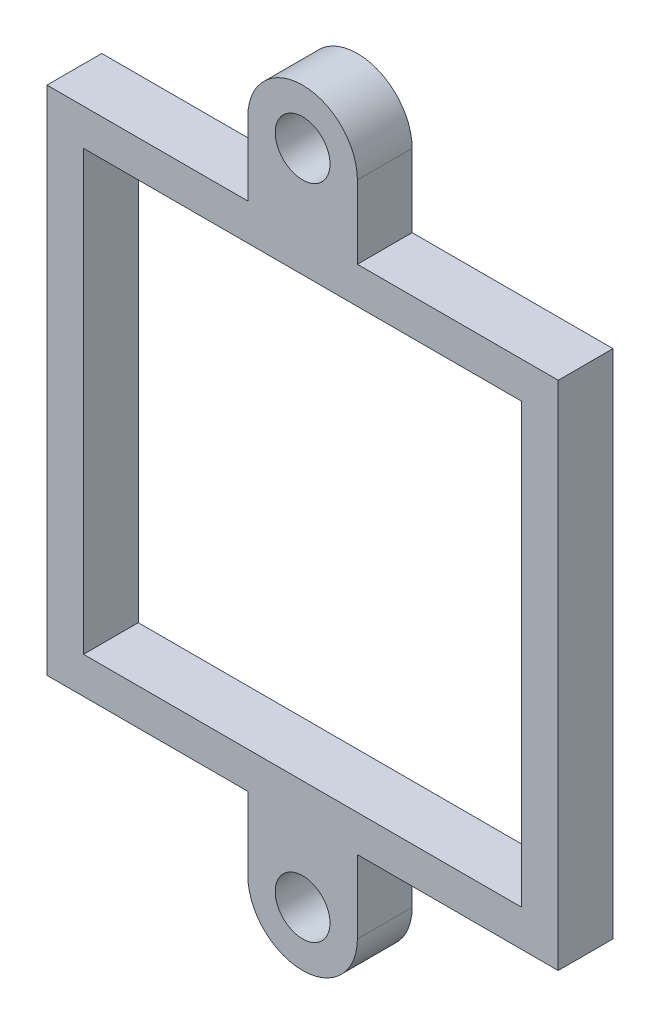
ISO-10303-21;
HEADER;
FILE_DESCRIPTION(('STEP AP214'),'2;1');
FILE_NAME('part.step','',(''),(''),'','','');
FILE_SCHEMA(('AUTOMOTIVE_DESIGN { 1 0 10303 214 1 1 1 1 }'));
ENDSEC;
DATA;
#1=APPLICATION_CONTEXT('core data for automotive mechanical design processes');
#2=APPLICATION_PROTOCOL_DEFINITION('international standard','automotive_design',2000,#1);
#3=PRODUCT_CONTEXT('',#1,'mechanical');
#4=PRODUCT('Part','Part','',(#3));
#5=PRODUCT_RELATED_PRODUCT_CATEGORY('part','',(#4));
#6=PRODUCT_DEFINITION_FORMATION('','',#4);
#7=PRODUCT_DEFINITION_CONTEXT('part definition',#1,'design');
#8=PRODUCT_DEFINITION('design','',#6,#7);
#9=PRODUCT_DEFINITION_SHAPE('','',#8);
#10=(LENGTH_UNIT() NAMED_UNIT(*) SI_UNIT(.MILLI.,.METRE.));
#11=(NAMED_UNIT(*) PLANE_ANGLE_UNIT() SI_UNIT($,.RADIAN.));
#12=(NAMED_UNIT(*) SI_UNIT($,.STERADIAN.) SOLID_ANGLE_UNIT());
#13=UNCERTAINTY_MEASURE_WITH_UNIT(LENGTH_MEASURE(1.E-05),#10,'distance_accuracy_value','');
#14=(GEOMETRIC_REPRESENTATION_CONTEXT(3) GLOBAL_UNCERTAINTY_ASSIGNED_CONTEXT((#13)) GLOBAL_UNIT_ASSIGNED_CONTEXT((#10,
#11,#12)) REPRESENTATION_CONTEXT('',''));
#15=CARTESIAN_POINT('',(0.,0.,0.));
#16=DIRECTION('',(0.,0.,1.));
#17=DIRECTION('',(1.,0.,0.));
#18=AXIS2_PLACEMENT_3D('',#15,#16,#17);
#19=CARTESIAN_POINT('',(-1.5,10.5,0.));
#20=DIRECTION('',(-1.,0.,0.));
#21=DIRECTION('',(0.,0.,1.));
#22=AXIS2_PLACEMENT_3D('',#19,#20,#21);
#23=PLANE('',#22);
#24=DIRECTION('',(0.,-1.,0.));
#25=VECTOR('',#24,1.);
#26=CARTESIAN_POINT('',(-1.5,10.5,1.5));
#27=LINE('',#26,#25);
#28=CARTESIAN_POINT('',(-1.5,9.,1.5));
#29=VERTEX_POINT('',#28);
#30=CARTESIAN_POINT('',(-1.5,7.,1.5));
#31=VERTEX_POINT('',#30);
#32=EDGE_CURVE('E203',#29,#31,#27,.T.);
#33=ORIENTED_EDGE('',*,*,#32,.F.);
#34=DIRECTION('',(0.,0.,1.));
#35=VECTOR('',#34,1.);
#36=CARTESIAN_POINT('',(-1.5,9.,-2.5));
#37=LINE('',#36,#35);
#38=CARTESIAN_POINT('',(-1.5,9.,0.));
#39=VERTEX_POINT('',#38);
#40=EDGE_CURVE('E189',#39,#29,#37,.T.);
#41=ORIENTED_EDGE('',*,*,#40,.F.);
#42=DIRECTION('',(0.,-1.,0.));
#43=VECTOR('',#42,1.);
#44=CARTESIAN_POINT('',(-1.5,10.5,0.));
#45=LINE('',#44,#43);
#46=CARTESIAN_POINT('',(-1.5,7.,0.));
#47=VERTEX_POINT('',#46);
#48=EDGE_CURVE('E86',#39,#47,#45,.T.);
#49=ORIENTED_EDGE('',*,*,#48,.T.);
#50=DIRECTION('',(0.,0.,-1.));
#51=VECTOR('',#50,1.);
#52=CARTESIAN_POINT('',(-1.5,7.,0.));
#53=LINE('',#52,#51);
#54=EDGE_CURVE('E204',#31,#47,#53,.T.);
#55=ORIENTED_EDGE('',*,*,#54,.F.);
#56=EDGE_LOOP('',(#33,#41,#49,#55));
#57=FACE_BOUND('',#56,.T.);
#58=ADVANCED_FACE('F70',(#57),#23,.T.);
#59=CARTESIAN_POINT('',(-7.,7.,1.5));
#60=DIRECTION('',(0.,-1.,0.));
#61=DIRECTION('',(1.,0.,0.));
#62=AXIS2_PLACEMENT_3D('',#59,#60,#61);
#63=PLANE('',#62);
#64=DIRECTION('',(-1.,0.,0.));
#65=VECTOR('',#64,1.);
#66=CARTESIAN_POINT('',(-7.,7.,0.));
#67=LINE('',#66,#65);
#68=CARTESIAN_POINT('',(7.,7.,0.));
#69=VERTEX_POINT('',#68);
#70=CARTESIAN_POINT('',(1.5,7.,0.));
#71=VERTEX_POINT('',#70);
#72=EDGE_CURVE('E274',#69,#71,#67,.T.);
#73=ORIENTED_EDGE('',*,*,#72,.T.);
#74=DIRECTION('',(0.,0.,1.));
#75=VECTOR('',#74,1.);
#76=CARTESIAN_POINT('',(1.5,7.,0.));
#77=LINE('',#76,#75);
#78=CARTESIAN_POINT('',(1.5,7.,1.5));
#79=VERTEX_POINT('',#78);
#80=EDGE_CURVE('E207',#71,#79,#77,.T.);
#81=ORIENTED_EDGE('',*,*,#80,.T.);
#82=DIRECTION('',(-1.,0.,0.));
#83=VECTOR('',#82,1.);
#84=CARTESIAN_POINT('',(-7.,7.,1.5));
#85=LINE('',#84,#83);
#86=CARTESIAN_POINT('',(7.,7.,1.5));
#87=VERTEX_POINT('',#86);
#88=EDGE_CURVE('E202',#87,#79,#85,.T.);
#89=ORIENTED_EDGE('',*,*,#88,.F.);
#90=DIRECTION('',(0.,0.,-1.));
#91=VECTOR('',#90,1.);
#92=CARTESIAN_POINT('',(7.,7.,1.5));
#93=LINE('',#92,#91);
#94=EDGE_CURVE('E296',#87,#69,#93,.T.);
#95=ORIENTED_EDGE('',*,*,#94,.T.);
#96=EDGE_LOOP('',(#73,#81,#89,#95));
#97=FACE_BOUND('',#96,.T.);
#98=ADVANCED_FACE('F347',(#97),#63,.F.);
#99=CARTESIAN_POINT('',(0.,0.,1.5));
#100=DIRECTION('',(0.,0.,-1.));
#101=DIRECTION('',(-1.,0.,0.));
#102=AXIS2_PLACEMENT_3D('',#99,#100,#101);
#103=PLANE('',#102);
#104=CARTESIAN_POINT('',(0.,9.,1.5));
#105=DIRECTION('',(0.,0.,-1.));
#106=DIRECTION('',(1.,0.,0.));
#107=AXIS2_PLACEMENT_3D('',#104,#105,#106);
#108=CIRCLE('',#107,0.75);
#109=CARTESIAN_POINT('',(0.750000000000001,9.,1.5));
#110=VERTEX_POINT('',#109);
#111=EDGE_CURVE('E394',#110,#110,#108,.T.);
#112=ORIENTED_EDGE('',*,*,#111,.T.);
#113=EDGE_LOOP('',(#112));
#114=FACE_BOUND('',#113,.T.);
#115=CARTESIAN_POINT('',(0.,-9.,1.5));
#116=DIRECTION('',(0.,0.,1.));
#117=DIRECTION('',(1.,0.,0.));
#118=AXIS2_PLACEMENT_3D('',#115,#116,#117);
#119=CIRCLE('',#118,0.75);
#120=CARTESIAN_POINT('',(0.750000000000001,-9.,1.5));
#121=VERTEX_POINT('',#120);
#122=EDGE_CURVE('E213',#121,#121,#119,.T.);
#123=ORIENTED_EDGE('',*,*,#122,.F.);
#124=EDGE_LOOP('',(#123));
#125=FACE_BOUND('',#124,.T.);
#126=DIRECTION('',(0.,1.,0.));
#127=VECTOR('',#126,1.);
#128=CARTESIAN_POINT('',(6.,-6.,1.5));
#129=LINE('',#128,#127);
#130=CARTESIAN_POINT('',(6.,-6.,1.5));
#131=VERTEX_POINT('',#130);
#132=CARTESIAN_POINT('',(6.,6.,1.5));
#133=VERTEX_POINT('',#132);
#134=EDGE_CURVE('E239',#131,#133,#129,.T.);
#135=ORIENTED_EDGE('',*,*,#134,.F.);
#136=DIRECTION('',(1.,0.,0.));
#137=VECTOR('',#136,1.);
#138=CARTESIAN_POINT('',(-6.,-6.,1.5));
#139=LINE('',#138,#137);
#140=CARTESIAN_POINT('',(-6.,-6.,1.5));
#141=VERTEX_POINT('',#140);
#142=EDGE_CURVE('E247',#141,#131,#139,.T.);
#143=ORIENTED_EDGE('',*,*,#142,.F.);
#144=DIRECTION('',(0.,-1.,0.));
#145=VECTOR('',#144,1.);
#146=CARTESIAN_POINT('',(-6.,-6.,1.5));
#147=LINE('',#146,#145);
#148=CARTESIAN_POINT('',(-6.,6.,1.5));
#149=VERTEX_POINT('',#148);
#150=EDGE_CURVE('E244',#149,#141,#147,.T.);
#151=ORIENTED_EDGE('',*,*,#150,.F.);
#152=DIRECTION('',(-1.,0.,0.));
#153=VECTOR('',#152,1.);
#154=CARTESIAN_POINT('',(-6.,6.,1.5));
#155=LINE('',#154,#153);
#156=EDGE_CURVE('E241',#133,#149,#155,.T.);
#157=ORIENTED_EDGE('',*,*,#156,.F.);
#158=EDGE_LOOP('',(#135,#143,#151,#157));
#159=FACE_BOUND('',#158,.T.);
#160=DIRECTION('',(0.,-1.,0.));
#161=VECTOR('',#160,1.);
#162=CARTESIAN_POINT('',(1.5,10.5,1.5));
#163=LINE('',#162,#161);
#164=CARTESIAN_POINT('',(1.5,9.,1.5));
#165=VERTEX_POINT('',#164);
#166=EDGE_CURVE('E196',#165,#79,#163,.T.);
#167=ORIENTED_EDGE('',*,*,#166,.F.);
#168=CARTESIAN_POINT('',(0.,9.,1.5));
#169=DIRECTION('',(0.,0.,-1.));
#170=DIRECTION('',(1.,0.,0.));
#171=AXIS2_PLACEMENT_3D('',#168,#169,#170);
#172=CIRCLE('',#171,1.5);
#173=EDGE_CURVE('E185',#29,#165,#172,.T.);
#174=ORIENTED_EDGE('',*,*,#173,.F.);
#175=ORIENTED_EDGE('',*,*,#32,.T.);
#176=CARTESIAN_POINT('',(-7.,7.,1.5));
#177=VERTEX_POINT('',#176);
#178=EDGE_CURVE('E280',#31,#177,#85,.T.);
#179=ORIENTED_EDGE('',*,*,#178,.T.);
#180=DIRECTION('',(0.,-1.,0.));
#181=VECTOR('',#180,1.);
#182=CARTESIAN_POINT('',(-7.,-7.,1.5));
#183=LINE('',#182,#181);
#184=CARTESIAN_POINT('',(-7.,-7.,1.5));
#185=VERTEX_POINT('',#184);
#186=EDGE_CURVE('E270',#177,#185,#183,.T.);
#187=ORIENTED_EDGE('',*,*,#186,.T.);
#188=DIRECTION('',(1.,0.,0.));
#189=VECTOR('',#188,1.);
#190=CARTESIAN_POINT('',(-7.,-7.,1.5));
#191=LINE('',#190,#189);
#192=CARTESIAN_POINT('',(-1.5,-7.,1.5));
#193=VERTEX_POINT('',#192);
#194=EDGE_CURVE('E275',#185,#193,#191,.T.);
#195=ORIENTED_EDGE('',*,*,#194,.T.);
#196=DIRECTION('',(0.,1.,0.));
#197=VECTOR('',#196,1.);
#198=CARTESIAN_POINT('',(-1.5,-10.5,1.5));
#199=LINE('',#198,#197);
#200=CARTESIAN_POINT('',(-1.5,-9.,1.5));
#201=VERTEX_POINT('',#200);
#202=EDGE_CURVE('E235',#201,#193,#199,.T.);
#203=ORIENTED_EDGE('',*,*,#202,.F.);
#204=CARTESIAN_POINT('',(0.,-9.,1.5));
#205=DIRECTION('',(0.,0.,1.));
#206=DIRECTION('',(1.,0.,0.));
#207=AXIS2_PLACEMENT_3D('',#204,#205,#206);
#208=CIRCLE('',#207,1.5);
#209=CARTESIAN_POINT('',(1.5,-9.,1.5));
#210=VERTEX_POINT('',#209);
#211=EDGE_CURVE('E217',#201,#210,#208,.T.);
#212=ORIENTED_EDGE('',*,*,#211,.T.);
#213=DIRECTION('',(0.,1.,0.));
#214=VECTOR('',#213,1.);
#215=CARTESIAN_POINT('',(1.5,-10.5,1.5));
#216=LINE('',#215,#214);
#217=CARTESIAN_POINT('',(1.5,-7.,1.5));
#218=VERTEX_POINT('',#217);
#219=EDGE_CURVE('E94',#210,#218,#216,.T.);
#220=ORIENTED_EDGE('',*,*,#219,.T.);
#221=CARTESIAN_POINT('',(7.,-7.,1.5));
#222=VERTEX_POINT('',#221);
#223=EDGE_CURVE('E273',#218,#222,#191,.T.);
#224=ORIENTED_EDGE('',*,*,#223,.T.);
#225=DIRECTION('',(0.,1.,0.));
#226=VECTOR('',#225,1.);
#227=CARTESIAN_POINT('',(7.,-7.,1.5));
#228=LINE('',#227,#226);
#229=EDGE_CURVE('E278',#222,#87,#228,.T.);
#230=ORIENTED_EDGE('',*,*,#229,.T.);
#231=ORIENTED_EDGE('',*,*,#88,.T.);
#232=EDGE_LOOP('',(#167,#174,#175,#179,#187,#195,#203,#212,#220,#224,#230,#231));
#233=FACE_BOUND('',#232,.T.);
#234=ADVANCED_FACE('F200',(#114,#125,#159,#233),#103,.F.);
#235=CARTESIAN_POINT('',(0.,0.,0.));
#236=DIRECTION('',(0.,0.,-1.));
#237=DIRECTION('',(-1.,0.,0.));
#238=AXIS2_PLACEMENT_3D('',#235,#236,#237);
#239=PLANE('',#238);
#240=CARTESIAN_POINT('',(0.,9.,0.));
#241=DIRECTION('',(0.,0.,-1.));
#242=DIRECTION('',(-1.,0.,0.));
#243=AXIS2_PLACEMENT_3D('',#240,#241,#242);
#244=CIRCLE('',#243,0.75);
#245=CARTESIAN_POINT('',(-0.75,9.,0.));
#246=VERTEX_POINT('',#245);
#247=EDGE_CURVE('E74',#246,#246,#244,.F.);
#248=ORIENTED_EDGE('',*,*,#247,.T.);
#249=EDGE_LOOP('',(#248));
#250=FACE_BOUND('',#249,.T.);
#251=CARTESIAN_POINT('',(0.,9.,0.));
#252=DIRECTION('',(0.,0.,-1.));
#253=DIRECTION('',(-1.,0.,0.));
#254=AXIS2_PLACEMENT_3D('',#251,#252,#253);
#255=CIRCLE('',#254,1.5);
#256=CARTESIAN_POINT('',(1.5,9.,0.));
#257=VERTEX_POINT('',#256);
#258=EDGE_CURVE('E390',#257,#39,#255,.F.);
#259=ORIENTED_EDGE('',*,*,#258,.F.);
#260=DIRECTION('',(0.,-1.,0.));
#261=VECTOR('',#260,1.);
#262=CARTESIAN_POINT('',(1.5,10.5,0.));
#263=LINE('',#262,#261);
#264=EDGE_CURVE('E198',#257,#71,#263,.T.);
#265=ORIENTED_EDGE('',*,*,#264,.T.);
#266=ORIENTED_EDGE('',*,*,#72,.F.);
#267=DIRECTION('',(0.,1.,0.));
#268=VECTOR('',#267,1.);
#269=CARTESIAN_POINT('',(7.,-7.,0.));
#270=LINE('',#269,#268);
#271=CARTESIAN_POINT('',(7.,-7.,0.));
#272=VERTEX_POINT('',#271);
#273=EDGE_CURVE('E289',#272,#69,#270,.T.);
#274=ORIENTED_EDGE('',*,*,#273,.F.);
#275=DIRECTION('',(1.,0.,0.));
#276=VECTOR('',#275,1.);
#277=CARTESIAN_POINT('',(-7.,-7.,0.));
#278=LINE('',#277,#276);
#279=CARTESIAN_POINT('',(1.5,-7.,0.));
#280=VERTEX_POINT('',#279);
#281=EDGE_CURVE('E285',#280,#272,#278,.T.);
#282=ORIENTED_EDGE('',*,*,#281,.F.);
#283=DIRECTION('',(0.,1.,0.));
#284=VECTOR('',#283,1.);
#285=CARTESIAN_POINT('',(1.5,-10.5,0.));
#286=LINE('',#285,#284);
#287=CARTESIAN_POINT('',(1.5,-9.,0.));
#288=VERTEX_POINT('',#287);
#289=EDGE_CURVE('E231',#288,#280,#286,.T.);
#290=ORIENTED_EDGE('',*,*,#289,.F.);
#291=CARTESIAN_POINT('',(0.,-9.,0.));
#292=DIRECTION('',(0.,0.,-1.));
#293=DIRECTION('',(-1.,0.,0.));
#294=AXIS2_PLACEMENT_3D('',#291,#292,#293);
#295=CIRCLE('',#294,1.5);
#296=CARTESIAN_POINT('',(-1.5,-9.,0.));
#297=VERTEX_POINT('',#296);
#298=EDGE_CURVE('E222',#288,#297,#295,.T.);
#299=ORIENTED_EDGE('',*,*,#298,.T.);
#300=DIRECTION('',(0.,1.,0.));
#301=VECTOR('',#300,1.);
#302=CARTESIAN_POINT('',(-1.5,-10.5,0.));
#303=LINE('',#302,#301);
#304=CARTESIAN_POINT('',(-1.5,-7.,0.));
#305=VERTEX_POINT('',#304);
#306=EDGE_CURVE('E233',#297,#305,#303,.T.);
#307=ORIENTED_EDGE('',*,*,#306,.T.);
#308=CARTESIAN_POINT('',(-7.,-7.,0.));
#309=VERTEX_POINT('',#308);
#310=EDGE_CURVE('E286',#309,#305,#278,.T.);
#311=ORIENTED_EDGE('',*,*,#310,.F.);
#312=DIRECTION('',(0.,-1.,0.));
#313=VECTOR('',#312,1.);
#314=CARTESIAN_POINT('',(-7.,-7.,0.));
#315=LINE('',#314,#313);
#316=CARTESIAN_POINT('',(-7.,7.,0.));
#317=VERTEX_POINT('',#316);
#318=EDGE_CURVE('E269',#317,#309,#315,.T.);
#319=ORIENTED_EDGE('',*,*,#318,.F.);
#320=EDGE_CURVE('E291',#47,#317,#67,.T.);
#321=ORIENTED_EDGE('',*,*,#320,.F.);
#322=ORIENTED_EDGE('',*,*,#48,.F.);
#323=EDGE_LOOP('',(#259,#265,#266,#274,#282,#290,#299,#307,#311,#319,#321,#322));
#324=FACE_BOUND('',#323,.T.);
#325=CARTESIAN_POINT('',(0.,-9.,0.));
#326=DIRECTION('',(0.,0.,-1.));
#327=DIRECTION('',(-1.,0.,0.));
#328=AXIS2_PLACEMENT_3D('',#325,#326,#327);
#329=CIRCLE('',#328,0.75);
#330=CARTESIAN_POINT('',(-0.75,-9.,0.));
#331=VERTEX_POINT('',#330);
#332=EDGE_CURVE('E216',#331,#331,#329,.T.);
#333=ORIENTED_EDGE('',*,*,#332,.F.);
#334=EDGE_LOOP('',(#333));
#335=FACE_BOUND('',#334,.T.);
#336=DIRECTION('',(1.,0.,0.));
#337=VECTOR('',#336,1.);
#338=CARTESIAN_POINT('',(-6.,-6.,0.));
#339=LINE('',#338,#337);
#340=CARTESIAN_POINT('',(-6.,-6.,0.));
#341=VERTEX_POINT('',#340);
#342=CARTESIAN_POINT('',(6.,-6.,0.));
#343=VERTEX_POINT('',#342);
#344=EDGE_CURVE('E242',#341,#343,#339,.T.);
#345=ORIENTED_EDGE('',*,*,#344,.T.);
#346=DIRECTION('',(0.,1.,0.));
#347=VECTOR('',#346,1.);
#348=CARTESIAN_POINT('',(6.,-6.,0.));
#349=LINE('',#348,#347);
#350=CARTESIAN_POINT('',(6.,6.,0.));
#351=VERTEX_POINT('',#350);
#352=EDGE_CURVE('E238',#343,#351,#349,.T.);
#353=ORIENTED_EDGE('',*,*,#352,.T.);
#354=DIRECTION('',(-1.,0.,0.));
#355=VECTOR('',#354,1.);
#356=CARTESIAN_POINT('',(-6.,6.,0.));
#357=LINE('',#356,#355);
#358=CARTESIAN_POINT('',(-6.,6.,0.));
#359=VERTEX_POINT('',#358);
#360=EDGE_CURVE('E252',#351,#359,#357,.T.);
#361=ORIENTED_EDGE('',*,*,#360,.T.);
#362=DIRECTION('',(0.,-1.,0.));
#363=VECTOR('',#362,1.);
#364=CARTESIAN_POINT('',(-6.,-6.,0.));
#365=LINE('',#364,#363);
#366=EDGE_CURVE('E255',#359,#341,#365,.T.);
#367=ORIENTED_EDGE('',*,*,#366,.T.);
#368=EDGE_LOOP('',(#345,#353,#361,#367));
#369=FACE_BOUND('',#368,.T.);
#370=ADVANCED_FACE('F313',(#250,#324,#335,#369),#239,.T.);
#371=CARTESIAN_POINT('',(1.5,-10.5,0.));
#372=DIRECTION('',(-1.,0.,0.));
#373=DIRECTION('',(0.,0.,1.));
#374=AXIS2_PLACEMENT_3D('',#371,#372,#373);
#375=PLANE('',#374);
#376=DIRECTION('',(0.,0.,1.));
#377=VECTOR('',#376,1.);
#378=CARTESIAN_POINT('',(1.5,-9.,-2.5));
#379=LINE('',#378,#377);
#380=EDGE_CURVE('E79',#288,#210,#379,.T.);
#381=ORIENTED_EDGE('',*,*,#380,.F.);
#382=ORIENTED_EDGE('',*,*,#289,.T.);
#383=DIRECTION('',(0.,0.,1.));
#384=VECTOR('',#383,1.);
#385=CARTESIAN_POINT('',(1.5,-7.,0.));
#386=LINE('',#385,#384);
#387=EDGE_CURVE('E225',#280,#218,#386,.T.);
#388=ORIENTED_EDGE('',*,*,#387,.T.);
#389=ORIENTED_EDGE('',*,*,#219,.F.);
#390=EDGE_LOOP('',(#381,#382,#388,#389));
#391=FACE_BOUND('',#390,.T.);
#392=ADVANCED_FACE('F316',(#391),#375,.F.);
#393=CARTESIAN_POINT('',(-7.,-7.,1.5));
#394=DIRECTION('',(0.,1.,0.));
#395=DIRECTION('',(0.,0.,1.));
#396=AXIS2_PLACEMENT_3D('',#393,#394,#395);
#397=PLANE('',#396);
#398=ORIENTED_EDGE('',*,*,#387,.F.);
#399=ORIENTED_EDGE('',*,*,#281,.T.);
#400=DIRECTION('',(0.,0.,-1.));
#401=VECTOR('',#400,1.);
#402=CARTESIAN_POINT('',(7.,-7.,1.5));
#403=LINE('',#402,#401);
#404=EDGE_CURVE('E299',#222,#272,#403,.T.);
#405=ORIENTED_EDGE('',*,*,#404,.F.);
#406=ORIENTED_EDGE('',*,*,#223,.F.);
#407=EDGE_LOOP('',(#398,#399,#405,#406));
#408=FACE_BOUND('',#407,.T.);
#409=ADVANCED_FACE('F370',(#408),#397,.F.);
#410=DIRECTION('',(0.,0.,-1.));
#411=VECTOR('',#410,1.);
#412=CARTESIAN_POINT('',(-1.5,-7.,0.));
#413=LINE('',#412,#411);
#414=EDGE_CURVE('E228',#193,#305,#413,.T.);
#415=ORIENTED_EDGE('',*,*,#414,.F.);
#416=ORIENTED_EDGE('',*,*,#194,.F.);
#417=DIRECTION('',(0.,0.,-1.));
#418=VECTOR('',#417,1.);
#419=CARTESIAN_POINT('',(-7.,-7.,1.5));
#420=LINE('',#419,#418);
#421=EDGE_CURVE('E302',#185,#309,#420,.T.);
#422=ORIENTED_EDGE('',*,*,#421,.T.);
#423=ORIENTED_EDGE('',*,*,#310,.T.);
#424=EDGE_LOOP('',(#415,#416,#422,#423));
#425=FACE_BOUND('',#424,.T.);
#426=ADVANCED_FACE('F375',(#425),#397,.F.);
#427=CARTESIAN_POINT('',(-7.,-7.,1.5));
#428=DIRECTION('',(1.,0.,0.));
#429=DIRECTION('',(0.,0.,-1.));
#430=AXIS2_PLACEMENT_3D('',#427,#428,#429);
#431=PLANE('',#430);
#432=ORIENTED_EDGE('',*,*,#318,.T.);
#433=ORIENTED_EDGE('',*,*,#421,.F.);
#434=ORIENTED_EDGE('',*,*,#186,.F.);
#435=DIRECTION('',(0.,0.,-1.));
#436=VECTOR('',#435,1.);
#437=CARTESIAN_POINT('',(-7.,7.,1.5));
#438=LINE('',#437,#436);
#439=EDGE_CURVE('E282',#177,#317,#438,.T.);
#440=ORIENTED_EDGE('',*,*,#439,.T.);
#441=EDGE_LOOP('',(#432,#433,#434,#440));
#442=FACE_BOUND('',#441,.T.);
#443=ADVANCED_FACE('F72',(#442),#431,.F.);
#444=CARTESIAN_POINT('',(7.,-7.,1.5));
#445=DIRECTION('',(-1.,0.,0.));
#446=DIRECTION('',(0.,-1.,0.));
#447=AXIS2_PLACEMENT_3D('',#444,#445,#446);
#448=PLANE('',#447);
#449=ORIENTED_EDGE('',*,*,#273,.T.);
#450=ORIENTED_EDGE('',*,*,#94,.F.);
#451=ORIENTED_EDGE('',*,*,#229,.F.);
#452=ORIENTED_EDGE('',*,*,#404,.T.);
#453=EDGE_LOOP('',(#449,#450,#451,#452));
#454=FACE_BOUND('',#453,.T.);
#455=ADVANCED_FACE('F388',(#454),#448,.F.);
#456=ORIENTED_EDGE('',*,*,#178,.F.);
#457=ORIENTED_EDGE('',*,*,#54,.T.);
#458=ORIENTED_EDGE('',*,*,#320,.T.);
#459=ORIENTED_EDGE('',*,*,#439,.F.);
#460=EDGE_LOOP('',(#456,#457,#458,#459));
#461=FACE_BOUND('',#460,.T.);
#462=ADVANCED_FACE('F354',(#461),#63,.F.);
#463=CARTESIAN_POINT('',(6.,-6.,1.5));
#464=DIRECTION('',(-1.,0.,0.));
#465=DIRECTION('',(0.,0.,1.));
#466=AXIS2_PLACEMENT_3D('',#463,#464,#465);
#467=PLANE('',#466);
#468=ORIENTED_EDGE('',*,*,#352,.F.);
#469=DIRECTION('',(0.,0.,-1.));
#470=VECTOR('',#469,1.);
#471=CARTESIAN_POINT('',(6.,-6.,1.5));
#472=LINE('',#471,#470);
#473=EDGE_CURVE('E249',#131,#343,#472,.T.);
#474=ORIENTED_EDGE('',*,*,#473,.F.);
#475=ORIENTED_EDGE('',*,*,#134,.T.);
#476=DIRECTION('',(0.,0.,-1.));
#477=VECTOR('',#476,1.);
#478=CARTESIAN_POINT('',(6.,6.,1.5));
#479=LINE('',#478,#477);
#480=EDGE_CURVE('E266',#133,#351,#479,.T.);
#481=ORIENTED_EDGE('',*,*,#480,.T.);
#482=EDGE_LOOP('',(#468,#474,#475,#481));
#483=FACE_BOUND('',#482,.T.);
#484=ADVANCED_FACE('F327',(#483),#467,.T.);
#485=CARTESIAN_POINT('',(-6.,6.,1.5));
#486=DIRECTION('',(0.,-1.,0.));
#487=DIRECTION('',(0.,0.,-1.));
#488=AXIS2_PLACEMENT_3D('',#485,#486,#487);
#489=PLANE('',#488);
#490=ORIENTED_EDGE('',*,*,#360,.F.);
#491=ORIENTED_EDGE('',*,*,#480,.F.);
#492=ORIENTED_EDGE('',*,*,#156,.T.);
#493=DIRECTION('',(0.,0.,-1.));
#494=VECTOR('',#493,1.);
#495=CARTESIAN_POINT('',(-6.,6.,1.5));
#496=LINE('',#495,#494);
#497=EDGE_CURVE('E264',#149,#359,#496,.T.);
#498=ORIENTED_EDGE('',*,*,#497,.T.);
#499=EDGE_LOOP('',(#490,#491,#492,#498));
#500=FACE_BOUND('',#499,.T.);
#501=ADVANCED_FACE('F334',(#500),#489,.T.);
#502=CARTESIAN_POINT('',(-6.,-6.,1.5));
#503=DIRECTION('',(1.,0.,0.));
#504=DIRECTION('',(0.,0.,-1.));
#505=AXIS2_PLACEMENT_3D('',#502,#503,#504);
#506=PLANE('',#505);
#507=ORIENTED_EDGE('',*,*,#366,.F.);
#508=ORIENTED_EDGE('',*,*,#497,.F.);
#509=ORIENTED_EDGE('',*,*,#150,.T.);
#510=DIRECTION('',(0.,0.,-1.));
#511=VECTOR('',#510,1.);
#512=CARTESIAN_POINT('',(-6.,-6.,1.5));
#513=LINE('',#512,#511);
#514=EDGE_CURVE('E262',#141,#341,#513,.T.);
#515=ORIENTED_EDGE('',*,*,#514,.T.);
#516=EDGE_LOOP('',(#507,#508,#509,#515));
#517=FACE_BOUND('',#516,.T.);
#518=ADVANCED_FACE('F336',(#517),#506,.T.);
#519=CARTESIAN_POINT('',(-6.,-6.,1.5));
#520=DIRECTION('',(0.,1.,0.));
#521=DIRECTION('',(0.,0.,1.));
#522=AXIS2_PLACEMENT_3D('',#519,#520,#521);
#523=PLANE('',#522);
#524=ORIENTED_EDGE('',*,*,#344,.F.);
#525=ORIENTED_EDGE('',*,*,#514,.F.);
#526=ORIENTED_EDGE('',*,*,#142,.T.);
#527=ORIENTED_EDGE('',*,*,#473,.T.);
#528=EDGE_LOOP('',(#524,#525,#526,#527));
#529=FACE_BOUND('',#528,.T.);
#530=ADVANCED_FACE('F322',(#529),#523,.T.);
#531=CARTESIAN_POINT('',(-1.5,-10.5,0.));
#532=DIRECTION('',(1.,0.,0.));
#533=DIRECTION('',(0.,0.,-1.));
#534=AXIS2_PLACEMENT_3D('',#531,#532,#533);
#535=PLANE('',#534);
#536=ORIENTED_EDGE('',*,*,#306,.F.);
#537=DIRECTION('',(0.,0.,1.));
#538=VECTOR('',#537,1.);
#539=CARTESIAN_POINT('',(-1.5,-9.,-2.5));
#540=LINE('',#539,#538);
#541=EDGE_CURVE('E219',#297,#201,#540,.T.);
#542=ORIENTED_EDGE('',*,*,#541,.T.);
#543=ORIENTED_EDGE('',*,*,#202,.T.);
#544=ORIENTED_EDGE('',*,*,#414,.T.);
#545=EDGE_LOOP('',(#536,#542,#543,#544));
#546=FACE_BOUND('',#545,.T.);
#547=ADVANCED_FACE('F343',(#546),#535,.F.);
#548=CARTESIAN_POINT('',(0.,-9.,-2.5));
#549=DIRECTION('',(0.,0.,1.));
#550=DIRECTION('',(1.,0.,0.));
#551=AXIS2_PLACEMENT_3D('',#548,#549,#550);
#552=CYLINDRICAL_SURFACE('',#551,1.5);
#553=ORIENTED_EDGE('',*,*,#298,.F.);
#554=ORIENTED_EDGE('',*,*,#380,.T.);
#555=ORIENTED_EDGE('',*,*,#211,.F.);
#556=ORIENTED_EDGE('',*,*,#541,.F.);
#557=EDGE_LOOP('',(#553,#554,#555,#556));
#558=FACE_BOUND('',#557,.T.);
#559=ADVANCED_FACE('F362',(#558),#552,.T.);
#560=CARTESIAN_POINT('',(0.,-9.,-2.5));
#561=DIRECTION('',(0.,0.,1.));
#562=DIRECTION('',(1.,0.,0.));
#563=AXIS2_PLACEMENT_3D('',#560,#561,#562);
#564=CYLINDRICAL_SURFACE('',#563,0.75);
#565=ORIENTED_EDGE('',*,*,#332,.T.);
#566=EDGE_LOOP('',(#565));
#567=FACE_BOUND('',#566,.T.);
#568=ORIENTED_EDGE('',*,*,#122,.T.);
#569=EDGE_LOOP('',(#568));
#570=FACE_BOUND('',#569,.T.);
#571=ADVANCED_FACE('F310',(#567,#570),#564,.F.);
#572=CARTESIAN_POINT('',(1.5,10.5,0.));
#573=DIRECTION('',(1.,0.,0.));
#574=DIRECTION('',(0.,0.,-1.));
#575=AXIS2_PLACEMENT_3D('',#572,#573,#574);
#576=PLANE('',#575);
#577=DIRECTION('',(0.,0.,1.));
#578=VECTOR('',#577,1.);
#579=CARTESIAN_POINT('',(1.5,9.,-2.5));
#580=LINE('',#579,#578);
#581=EDGE_CURVE('E12',#165,#257,#580,.F.);
#582=ORIENTED_EDGE('',*,*,#581,.F.);
#583=ORIENTED_EDGE('',*,*,#166,.T.);
#584=ORIENTED_EDGE('',*,*,#80,.F.);
#585=ORIENTED_EDGE('',*,*,#264,.F.);
#586=EDGE_LOOP('',(#582,#583,#584,#585));
#587=FACE_BOUND('',#586,.T.);
#588=ADVANCED_FACE('F194',(#587),#576,.T.);
#589=CARTESIAN_POINT('',(0.,9.,-2.5));
#590=DIRECTION('',(0.,0.,1.));
#591=DIRECTION('',(1.,0.,0.));
#592=AXIS2_PLACEMENT_3D('',#589,#590,#591);
#593=CYLINDRICAL_SURFACE('',#592,1.5);
#594=ORIENTED_EDGE('',*,*,#258,.T.);
#595=ORIENTED_EDGE('',*,*,#40,.T.);
#596=ORIENTED_EDGE('',*,*,#173,.T.);
#597=ORIENTED_EDGE('',*,*,#581,.T.);
#598=EDGE_LOOP('',(#594,#595,#596,#597));
#599=FACE_BOUND('',#598,.T.);
#600=ADVANCED_FACE('F187',(#599),#593,.T.);
#601=CARTESIAN_POINT('',(0.,9.,-2.5));
#602=DIRECTION('',(0.,0.,1.));
#603=DIRECTION('',(1.,0.,0.));
#604=AXIS2_PLACEMENT_3D('',#601,#602,#603);
#605=CYLINDRICAL_SURFACE('',#604,0.75);
#606=ORIENTED_EDGE('',*,*,#247,.F.);
#607=EDGE_LOOP('',(#606));
#608=FACE_BOUND('',#607,.T.);
#609=ORIENTED_EDGE('',*,*,#111,.F.);
#610=EDGE_LOOP('',(#609));
#611=FACE_BOUND('',#610,.T.);
#612=ADVANCED_FACE('F401',(#608,#611),#605,.F.);
#613=CLOSED_SHELL('',(#58,#98,#234,#370,#392,#409,#426,#443,#455,#462,#484,#501,#518,#530,#547,
#559,#571,#588,#600,#612));
#614=MANIFOLD_SOLID_BREP('B2',#613);
#615=ADVANCED_BREP_SHAPE_REPRESENTATION('',(#18,#614),#14);
#616=SHAPE_DEFINITION_REPRESENTATION(#9,#615);
ENDSEC;
END-ISO-10303-21;
